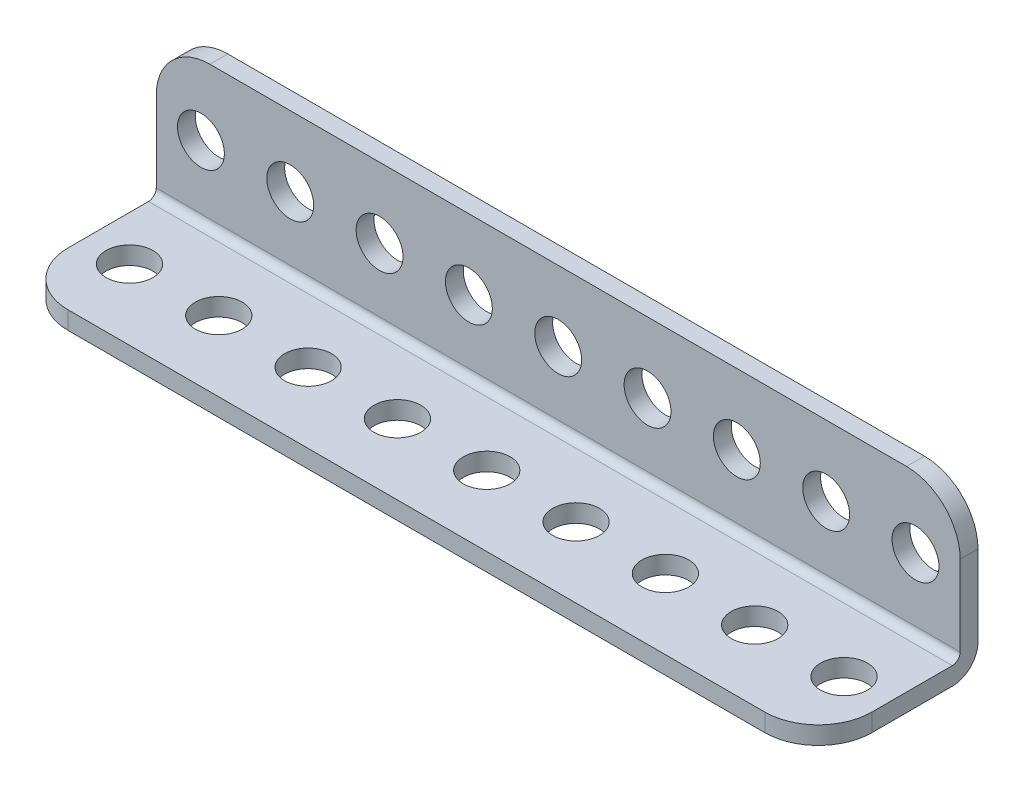
ISO-10303-21;
HEADER;
FILE_DESCRIPTION(('STEP AP214'),'2;1');
FILE_NAME('part.step','',(''),(''),'','','');
FILE_SCHEMA(('AUTOMOTIVE_DESIGN { 1 0 10303 214 1 1 1 1 }'));
ENDSEC;
DATA;
#1=APPLICATION_CONTEXT('core data for automotive mechanical design processes');
#2=APPLICATION_PROTOCOL_DEFINITION('international standard','automotive_design',2000,#1);
#3=PRODUCT_CONTEXT('',#1,'mechanical');
#4=PRODUCT('Part','Part','',(#3));
#5=PRODUCT_RELATED_PRODUCT_CATEGORY('part','',(#4));
#6=PRODUCT_DEFINITION_FORMATION('','',#4);
#7=PRODUCT_DEFINITION_CONTEXT('part definition',#1,'design');
#8=PRODUCT_DEFINITION('design','',#6,#7);
#9=PRODUCT_DEFINITION_SHAPE('','',#8);
#10=(LENGTH_UNIT() NAMED_UNIT(*) SI_UNIT(.MILLI.,.METRE.));
#11=(NAMED_UNIT(*) PLANE_ANGLE_UNIT() SI_UNIT($,.RADIAN.));
#12=(NAMED_UNIT(*) SI_UNIT($,.STERADIAN.) SOLID_ANGLE_UNIT());
#13=UNCERTAINTY_MEASURE_WITH_UNIT(LENGTH_MEASURE(1.E-05),#10,'distance_accuracy_value','');
#14=(GEOMETRIC_REPRESENTATION_CONTEXT(3) GLOBAL_UNCERTAINTY_ASSIGNED_CONTEXT((#13)) GLOBAL_UNIT_ASSIGNED_CONTEXT((#10,
#11,#12)) REPRESENTATION_CONTEXT('',''));
#15=CARTESIAN_POINT('',(0.,0.,0.));
#16=DIRECTION('',(0.,0.,1.));
#17=DIRECTION('',(1.,0.,0.));
#18=AXIS2_PLACEMENT_3D('',#15,#16,#17);
#19=CARTESIAN_POINT('',(67.2,7.9,-14.3));
#20=DIRECTION('',(0.,0.,1.));
#21=DIRECTION('',(0.,-1.,0.));
#22=AXIS2_PLACEMENT_3D('',#19,#20,#21);
#23=CYLINDRICAL_SURFACE('',#22,4.8);
#24=CARTESIAN_POINT('',(67.2,7.9,-14.3));
#25=DIRECTION('',(0.,0.,1.));
#26=DIRECTION('',(0.,-1.,0.));
#27=AXIS2_PLACEMENT_3D('',#24,#25,#26);
#28=CIRCLE('',#27,4.8);
#29=CARTESIAN_POINT('',(72.,7.9,-14.3));
#30=VERTEX_POINT('',#29);
#31=CARTESIAN_POINT('',(67.2,12.7,-14.3));
#32=VERTEX_POINT('',#31);
#33=EDGE_CURVE('E164',#30,#32,#28,.T.);
#34=ORIENTED_EDGE('',*,*,#33,.T.);
#35=DIRECTION('',(0.,0.,-1.));
#36=VECTOR('',#35,1.);
#37=CARTESIAN_POINT('',(67.2,12.7,-14.3));
#38=LINE('',#37,#36);
#39=CARTESIAN_POINT('',(67.2,12.7,-12.7));
#40=VERTEX_POINT('',#39);
#41=EDGE_CURVE('E175',#32,#40,#38,.F.);
#42=ORIENTED_EDGE('',*,*,#41,.T.);
#43=CARTESIAN_POINT('',(67.2,7.90000000000001,-12.7));
#44=DIRECTION('',(0.,0.,1.));
#45=DIRECTION('',(0.,-1.,0.));
#46=AXIS2_PLACEMENT_3D('',#43,#44,#45);
#47=CIRCLE('',#46,4.8);
#48=CARTESIAN_POINT('',(72.,7.90000000000001,-12.7));
#49=VERTEX_POINT('',#48);
#50=EDGE_CURVE('E166',#49,#40,#47,.T.);
#51=ORIENTED_EDGE('',*,*,#50,.F.);
#52=DIRECTION('',(0.,0.,1.));
#53=VECTOR('',#52,1.);
#54=CARTESIAN_POINT('',(72.,7.9,-14.3));
#55=LINE('',#54,#53);
#56=EDGE_CURVE('E178',#49,#30,#55,.F.);
#57=ORIENTED_EDGE('',*,*,#56,.T.);
#58=EDGE_LOOP('',(#34,#42,#51,#57));
#59=FACE_BOUND('',#58,.T.);
#60=ADVANCED_FACE('F16',(#59),#23,.T.);
#61=CARTESIAN_POINT('',(72.,12.7,-14.3));
#62=DIRECTION('',(0.,-1.,0.));
#63=DIRECTION('',(0.,0.,-1.));
#64=AXIS2_PLACEMENT_3D('',#61,#62,#63);
#65=PLANE('',#64);
#66=DIRECTION('',(1.,0.,0.));
#67=VECTOR('',#66,1.);
#68=CARTESIAN_POINT('',(0.,12.7,-12.7));
#69=LINE('',#68,#67);
#70=CARTESIAN_POINT('',(4.8,12.7,-12.7));
#71=VERTEX_POINT('',#70);
#72=EDGE_CURVE('E165',#40,#71,#69,.F.);
#73=ORIENTED_EDGE('',*,*,#72,.F.);
#74=ORIENTED_EDGE('',*,*,#41,.F.);
#75=DIRECTION('',(1.,0.,0.));
#76=VECTOR('',#75,1.);
#77=CARTESIAN_POINT('',(0.,12.7,-14.3));
#78=LINE('',#77,#76);
#79=CARTESIAN_POINT('',(4.8,12.7,-14.3));
#80=VERTEX_POINT('',#79);
#81=EDGE_CURVE('E161',#32,#80,#78,.F.);
#82=ORIENTED_EDGE('',*,*,#81,.T.);
#83=DIRECTION('',(0.,0.,1.));
#84=VECTOR('',#83,1.);
#85=CARTESIAN_POINT('',(4.8,12.7,-14.3));
#86=LINE('',#85,#84);
#87=EDGE_CURVE('E172',#71,#80,#86,.F.);
#88=ORIENTED_EDGE('',*,*,#87,.F.);
#89=EDGE_LOOP('',(#73,#74,#82,#88));
#90=FACE_BOUND('',#89,.T.);
#91=ADVANCED_FACE('F340',(#90),#65,.F.);
#92=CARTESIAN_POINT('',(4.8,7.9,-14.3));
#93=DIRECTION('',(0.,0.,1.));
#94=DIRECTION('',(0.,-1.,0.));
#95=AXIS2_PLACEMENT_3D('',#92,#93,#94);
#96=CYLINDRICAL_SURFACE('',#95,4.8);
#97=CARTESIAN_POINT('',(4.8,7.9,-14.3));
#98=DIRECTION('',(0.,0.,1.));
#99=DIRECTION('',(0.,-1.,0.));
#100=AXIS2_PLACEMENT_3D('',#97,#98,#99);
#101=CIRCLE('',#100,4.8);
#102=CARTESIAN_POINT('',(0.,7.9,-14.3));
#103=VERTEX_POINT('',#102);
#104=EDGE_CURVE('E163',#80,#103,#101,.T.);
#105=ORIENTED_EDGE('',*,*,#104,.T.);
#106=DIRECTION('',(0.,0.,1.));
#107=VECTOR('',#106,1.);
#108=CARTESIAN_POINT('',(0.,7.9,-14.3));
#109=LINE('',#108,#107);
#110=CARTESIAN_POINT('',(0.,7.90000000000001,-12.7));
#111=VERTEX_POINT('',#110);
#112=EDGE_CURVE('E109',#103,#111,#109,.T.);
#113=ORIENTED_EDGE('',*,*,#112,.T.);
#114=CARTESIAN_POINT('',(4.8,7.90000000000001,-12.7));
#115=DIRECTION('',(0.,0.,1.));
#116=DIRECTION('',(0.,-1.,0.));
#117=AXIS2_PLACEMENT_3D('',#114,#115,#116);
#118=CIRCLE('',#117,4.8);
#119=EDGE_CURVE('E117',#71,#111,#118,.T.);
#120=ORIENTED_EDGE('',*,*,#119,.F.);
#121=ORIENTED_EDGE('',*,*,#87,.T.);
#122=EDGE_LOOP('',(#105,#113,#120,#121));
#123=FACE_BOUND('',#122,.T.);
#124=ADVANCED_FACE('F342',(#123),#96,.T.);
#125=CARTESIAN_POINT('',(4.,6.4,-22.7));
#126=DIRECTION('',(0.,0.,1.));
#127=DIRECTION('',(1.,0.,0.));
#128=AXIS2_PLACEMENT_3D('',#125,#126,#127);
#129=CYLINDRICAL_SURFACE('',#128,2.1);
#130=CARTESIAN_POINT('',(4.,6.4,-12.7));
#131=DIRECTION('',(0.,0.,1.));
#132=DIRECTION('',(1.,0.,0.));
#133=AXIS2_PLACEMENT_3D('',#130,#131,#132);
#134=CIRCLE('',#133,2.1);
#135=CARTESIAN_POINT('',(6.1,6.4,-12.7));
#136=VERTEX_POINT('',#135);
#137=EDGE_CURVE('E116',#136,#136,#134,.F.);
#138=ORIENTED_EDGE('',*,*,#137,.F.);
#139=EDGE_LOOP('',(#138));
#140=FACE_BOUND('',#139,.T.);
#141=CARTESIAN_POINT('',(4.,6.4,-14.3));
#142=DIRECTION('',(0.,0.,1.));
#143=DIRECTION('',(1.,0.,0.));
#144=AXIS2_PLACEMENT_3D('',#141,#142,#143);
#145=CIRCLE('',#144,2.1);
#146=CARTESIAN_POINT('',(6.1,6.4,-14.3));
#147=VERTEX_POINT('',#146);
#148=EDGE_CURVE('E266',#147,#147,#145,.F.);
#149=ORIENTED_EDGE('',*,*,#148,.T.);
#150=EDGE_LOOP('',(#149));
#151=FACE_BOUND('',#150,.T.);
#152=ADVANCED_FACE('F344',(#140,#151),#129,.F.);
#153=CARTESIAN_POINT('',(12.,6.4,-22.7));
#154=DIRECTION('',(0.,0.,1.));
#155=DIRECTION('',(1.,0.,0.));
#156=AXIS2_PLACEMENT_3D('',#153,#154,#155);
#157=CYLINDRICAL_SURFACE('',#156,2.1);
#158=CARTESIAN_POINT('',(12.,6.4,-12.7));
#159=DIRECTION('',(0.,0.,1.));
#160=DIRECTION('',(1.,0.,0.));
#161=AXIS2_PLACEMENT_3D('',#158,#159,#160);
#162=CIRCLE('',#161,2.1);
#163=CARTESIAN_POINT('',(14.1,6.4,-12.7));
#164=VERTEX_POINT('',#163);
#165=EDGE_CURVE('E293',#164,#164,#162,.F.);
#166=ORIENTED_EDGE('',*,*,#165,.F.);
#167=EDGE_LOOP('',(#166));
#168=FACE_BOUND('',#167,.T.);
#169=CARTESIAN_POINT('',(12.,6.4,-14.3));
#170=DIRECTION('',(0.,0.,1.));
#171=DIRECTION('',(1.,0.,0.));
#172=AXIS2_PLACEMENT_3D('',#169,#170,#171);
#173=CIRCLE('',#172,2.1);
#174=CARTESIAN_POINT('',(14.1,6.4,-14.3));
#175=VERTEX_POINT('',#174);
#176=EDGE_CURVE('E263',#175,#175,#173,.F.);
#177=ORIENTED_EDGE('',*,*,#176,.T.);
#178=EDGE_LOOP('',(#177));
#179=FACE_BOUND('',#178,.T.);
#180=ADVANCED_FACE('F351',(#168,#179),#157,.F.);
#181=CARTESIAN_POINT('',(68.,6.4,-22.7));
#182=DIRECTION('',(0.,0.,1.));
#183=DIRECTION('',(1.,0.,0.));
#184=AXIS2_PLACEMENT_3D('',#181,#182,#183);
#185=CYLINDRICAL_SURFACE('',#184,2.1);
#186=CARTESIAN_POINT('',(68.,6.4,-12.7));
#187=DIRECTION('',(0.,0.,1.));
#188=DIRECTION('',(1.,0.,0.));
#189=AXIS2_PLACEMENT_3D('',#186,#187,#188);
#190=CIRCLE('',#189,2.1);
#191=CARTESIAN_POINT('',(70.1,6.4,-12.7));
#192=VERTEX_POINT('',#191);
#193=EDGE_CURVE('E290',#192,#192,#190,.F.);
#194=ORIENTED_EDGE('',*,*,#193,.F.);
#195=EDGE_LOOP('',(#194));
#196=FACE_BOUND('',#195,.T.);
#197=CARTESIAN_POINT('',(68.,6.4,-14.3));
#198=DIRECTION('',(0.,0.,1.));
#199=DIRECTION('',(1.,0.,0.));
#200=AXIS2_PLACEMENT_3D('',#197,#198,#199);
#201=CIRCLE('',#200,2.1);
#202=CARTESIAN_POINT('',(70.1,6.4,-14.3));
#203=VERTEX_POINT('',#202);
#204=EDGE_CURVE('E260',#203,#203,#201,.F.);
#205=ORIENTED_EDGE('',*,*,#204,.T.);
#206=EDGE_LOOP('',(#205));
#207=FACE_BOUND('',#206,.T.);
#208=ADVANCED_FACE('F443',(#196,#207),#185,.F.);
#209=CARTESIAN_POINT('',(60.,6.4,-22.7));
#210=DIRECTION('',(0.,0.,1.));
#211=DIRECTION('',(1.,0.,0.));
#212=AXIS2_PLACEMENT_3D('',#209,#210,#211);
#213=CYLINDRICAL_SURFACE('',#212,2.1);
#214=CARTESIAN_POINT('',(60.,6.4,-12.7));
#215=DIRECTION('',(0.,0.,1.));
#216=DIRECTION('',(1.,0.,0.));
#217=AXIS2_PLACEMENT_3D('',#214,#215,#216);
#218=CIRCLE('',#217,2.1);
#219=CARTESIAN_POINT('',(62.1,6.4,-12.7));
#220=VERTEX_POINT('',#219);
#221=EDGE_CURVE('E287',#220,#220,#218,.F.);
#222=ORIENTED_EDGE('',*,*,#221,.F.);
#223=EDGE_LOOP('',(#222));
#224=FACE_BOUND('',#223,.T.);
#225=CARTESIAN_POINT('',(60.,6.4,-14.3));
#226=DIRECTION('',(0.,0.,1.));
#227=DIRECTION('',(1.,0.,0.));
#228=AXIS2_PLACEMENT_3D('',#225,#226,#227);
#229=CIRCLE('',#228,2.1);
#230=CARTESIAN_POINT('',(62.1,6.4,-14.3));
#231=VERTEX_POINT('',#230);
#232=EDGE_CURVE('E257',#231,#231,#229,.F.);
#233=ORIENTED_EDGE('',*,*,#232,.T.);
#234=EDGE_LOOP('',(#233));
#235=FACE_BOUND('',#234,.T.);
#236=ADVANCED_FACE('F439',(#224,#235),#213,.F.);
#237=CARTESIAN_POINT('',(52.,6.4,-22.7));
#238=DIRECTION('',(0.,0.,1.));
#239=DIRECTION('',(1.,0.,0.));
#240=AXIS2_PLACEMENT_3D('',#237,#238,#239);
#241=CYLINDRICAL_SURFACE('',#240,2.1);
#242=CARTESIAN_POINT('',(52.,6.4,-12.7));
#243=DIRECTION('',(0.,0.,1.));
#244=DIRECTION('',(1.,0.,0.));
#245=AXIS2_PLACEMENT_3D('',#242,#243,#244);
#246=CIRCLE('',#245,2.1);
#247=CARTESIAN_POINT('',(54.1,6.4,-12.7));
#248=VERTEX_POINT('',#247);
#249=EDGE_CURVE('E284',#248,#248,#246,.F.);
#250=ORIENTED_EDGE('',*,*,#249,.F.);
#251=EDGE_LOOP('',(#250));
#252=FACE_BOUND('',#251,.T.);
#253=CARTESIAN_POINT('',(52.,6.4,-14.3));
#254=DIRECTION('',(0.,0.,1.));
#255=DIRECTION('',(1.,0.,0.));
#256=AXIS2_PLACEMENT_3D('',#253,#254,#255);
#257=CIRCLE('',#256,2.1);
#258=CARTESIAN_POINT('',(54.1,6.4,-14.3));
#259=VERTEX_POINT('',#258);
#260=EDGE_CURVE('E254',#259,#259,#257,.F.);
#261=ORIENTED_EDGE('',*,*,#260,.T.);
#262=EDGE_LOOP('',(#261));
#263=FACE_BOUND('',#262,.T.);
#264=ADVANCED_FACE('F435',(#252,#263),#241,.F.);
#265=CARTESIAN_POINT('',(44.,6.4,-22.7));
#266=DIRECTION('',(0.,0.,1.));
#267=DIRECTION('',(1.,0.,0.));
#268=AXIS2_PLACEMENT_3D('',#265,#266,#267);
#269=CYLINDRICAL_SURFACE('',#268,2.1);
#270=CARTESIAN_POINT('',(44.,6.4,-12.7));
#271=DIRECTION('',(0.,0.,1.));
#272=DIRECTION('',(1.,0.,0.));
#273=AXIS2_PLACEMENT_3D('',#270,#271,#272);
#274=CIRCLE('',#273,2.1);
#275=CARTESIAN_POINT('',(46.1,6.4,-12.7));
#276=VERTEX_POINT('',#275);
#277=EDGE_CURVE('E281',#276,#276,#274,.F.);
#278=ORIENTED_EDGE('',*,*,#277,.F.);
#279=EDGE_LOOP('',(#278));
#280=FACE_BOUND('',#279,.T.);
#281=CARTESIAN_POINT('',(44.,6.4,-14.3));
#282=DIRECTION('',(0.,0.,1.));
#283=DIRECTION('',(1.,0.,0.));
#284=AXIS2_PLACEMENT_3D('',#281,#282,#283);
#285=CIRCLE('',#284,2.1);
#286=CARTESIAN_POINT('',(46.1,6.4,-14.3));
#287=VERTEX_POINT('',#286);
#288=EDGE_CURVE('E251',#287,#287,#285,.F.);
#289=ORIENTED_EDGE('',*,*,#288,.T.);
#290=EDGE_LOOP('',(#289));
#291=FACE_BOUND('',#290,.T.);
#292=ADVANCED_FACE('F431',(#280,#291),#269,.F.);
#293=CARTESIAN_POINT('',(36.,6.4,-22.7));
#294=DIRECTION('',(0.,0.,1.));
#295=DIRECTION('',(1.,0.,0.));
#296=AXIS2_PLACEMENT_3D('',#293,#294,#295);
#297=CYLINDRICAL_SURFACE('',#296,2.1);
#298=CARTESIAN_POINT('',(36.,6.4,-12.7));
#299=DIRECTION('',(0.,0.,1.));
#300=DIRECTION('',(1.,0.,0.));
#301=AXIS2_PLACEMENT_3D('',#298,#299,#300);
#302=CIRCLE('',#301,2.1);
#303=CARTESIAN_POINT('',(38.1,6.4,-12.7));
#304=VERTEX_POINT('',#303);
#305=EDGE_CURVE('E278',#304,#304,#302,.F.);
#306=ORIENTED_EDGE('',*,*,#305,.F.);
#307=EDGE_LOOP('',(#306));
#308=FACE_BOUND('',#307,.T.);
#309=CARTESIAN_POINT('',(36.,6.4,-14.3));
#310=DIRECTION('',(0.,0.,1.));
#311=DIRECTION('',(1.,0.,0.));
#312=AXIS2_PLACEMENT_3D('',#309,#310,#311);
#313=CIRCLE('',#312,2.1);
#314=CARTESIAN_POINT('',(38.1,6.4,-14.3));
#315=VERTEX_POINT('',#314);
#316=EDGE_CURVE('E248',#315,#315,#313,.F.);
#317=ORIENTED_EDGE('',*,*,#316,.T.);
#318=EDGE_LOOP('',(#317));
#319=FACE_BOUND('',#318,.T.);
#320=ADVANCED_FACE('F427',(#308,#319),#297,.F.);
#321=CARTESIAN_POINT('',(28.,6.4,-22.7));
#322=DIRECTION('',(0.,0.,1.));
#323=DIRECTION('',(1.,0.,0.));
#324=AXIS2_PLACEMENT_3D('',#321,#322,#323);
#325=CYLINDRICAL_SURFACE('',#324,2.1);
#326=CARTESIAN_POINT('',(28.,6.4,-12.7));
#327=DIRECTION('',(0.,0.,1.));
#328=DIRECTION('',(1.,0.,0.));
#329=AXIS2_PLACEMENT_3D('',#326,#327,#328);
#330=CIRCLE('',#329,2.1);
#331=CARTESIAN_POINT('',(30.1,6.4,-12.7));
#332=VERTEX_POINT('',#331);
#333=EDGE_CURVE('E275',#332,#332,#330,.F.);
#334=ORIENTED_EDGE('',*,*,#333,.F.);
#335=EDGE_LOOP('',(#334));
#336=FACE_BOUND('',#335,.T.);
#337=CARTESIAN_POINT('',(28.,6.4,-14.3));
#338=DIRECTION('',(0.,0.,1.));
#339=DIRECTION('',(1.,0.,0.));
#340=AXIS2_PLACEMENT_3D('',#337,#338,#339);
#341=CIRCLE('',#340,2.1);
#342=CARTESIAN_POINT('',(30.1,6.4,-14.3));
#343=VERTEX_POINT('',#342);
#344=EDGE_CURVE('E245',#343,#343,#341,.F.);
#345=ORIENTED_EDGE('',*,*,#344,.T.);
#346=EDGE_LOOP('',(#345));
#347=FACE_BOUND('',#346,.T.);
#348=ADVANCED_FACE('F423',(#336,#347),#325,.F.);
#349=CARTESIAN_POINT('',(20.,6.4,-22.7));
#350=DIRECTION('',(0.,0.,1.));
#351=DIRECTION('',(1.,0.,0.));
#352=AXIS2_PLACEMENT_3D('',#349,#350,#351);
#353=CYLINDRICAL_SURFACE('',#352,2.1);
#354=CARTESIAN_POINT('',(20.,6.4,-12.7));
#355=DIRECTION('',(0.,0.,1.));
#356=DIRECTION('',(1.,0.,0.));
#357=AXIS2_PLACEMENT_3D('',#354,#355,#356);
#358=CIRCLE('',#357,2.1);
#359=CARTESIAN_POINT('',(22.1,6.4,-12.7));
#360=VERTEX_POINT('',#359);
#361=EDGE_CURVE('E272',#360,#360,#358,.F.);
#362=ORIENTED_EDGE('',*,*,#361,.F.);
#363=EDGE_LOOP('',(#362));
#364=FACE_BOUND('',#363,.T.);
#365=CARTESIAN_POINT('',(20.,6.4,-14.3));
#366=DIRECTION('',(0.,0.,1.));
#367=DIRECTION('',(1.,0.,0.));
#368=AXIS2_PLACEMENT_3D('',#365,#366,#367);
#369=CIRCLE('',#368,2.1);
#370=CARTESIAN_POINT('',(22.1,6.4,-14.3));
#371=VERTEX_POINT('',#370);
#372=EDGE_CURVE('E169',#371,#371,#369,.F.);
#373=ORIENTED_EDGE('',*,*,#372,.T.);
#374=EDGE_LOOP('',(#373));
#375=FACE_BOUND('',#374,.T.);
#376=ADVANCED_FACE('F420',(#364,#375),#353,.F.);
#377=CARTESIAN_POINT('',(0.,0.699999999999998,-12.));
#378=DIRECTION('',(-1.,0.,0.));
#379=DIRECTION('',(0.,-1.,0.));
#380=AXIS2_PLACEMENT_3D('',#377,#378,#379);
#381=CYLINDRICAL_SURFACE('',#380,0.700000000000001);
#382=DIRECTION('',(1.,0.,0.));
#383=VECTOR('',#382,1.);
#384=CARTESIAN_POINT('',(0.,0.700000000000005,-12.7));
#385=LINE('',#384,#383);
#386=CARTESIAN_POINT('',(0.,0.700000000000001,-12.7));
#387=VERTEX_POINT('',#386);
#388=CARTESIAN_POINT('',(72.,0.699999999999999,-12.7));
#389=VERTEX_POINT('',#388);
#390=EDGE_CURVE('E111',#387,#389,#385,.T.);
#391=ORIENTED_EDGE('',*,*,#390,.F.);
#392=CARTESIAN_POINT('',(0.,0.699999999999998,-12.));
#393=DIRECTION('',(-1.,0.,0.));
#394=DIRECTION('',(0.,-1.,0.));
#395=AXIS2_PLACEMENT_3D('',#392,#393,#394);
#396=CIRCLE('',#395,0.700000000000001);
#397=CARTESIAN_POINT('',(0.,0.,-12.));
#398=VERTEX_POINT('',#397);
#399=EDGE_CURVE('E19',#398,#387,#396,.F.);
#400=ORIENTED_EDGE('',*,*,#399,.F.);
#401=DIRECTION('',(1.,0.,0.));
#402=VECTOR('',#401,1.);
#403=CARTESIAN_POINT('',(0.,0.,-12.));
#404=LINE('',#403,#402);
#405=CARTESIAN_POINT('',(72.,0.,-12.));
#406=VERTEX_POINT('',#405);
#407=EDGE_CURVE('E157',#398,#406,#404,.T.);
#408=ORIENTED_EDGE('',*,*,#407,.T.);
#409=CARTESIAN_POINT('',(72.,0.699999999999992,-12.));
#410=DIRECTION('',(-1.,0.,0.));
#411=DIRECTION('',(0.,-1.,0.));
#412=AXIS2_PLACEMENT_3D('',#409,#410,#411);
#413=CIRCLE('',#412,0.700000000000001);
#414=EDGE_CURVE('E108',#389,#406,#413,.T.);
#415=ORIENTED_EDGE('',*,*,#414,.F.);
#416=EDGE_LOOP('',(#391,#400,#408,#415));
#417=FACE_BOUND('',#416,.T.);
#418=ADVANCED_FACE('F112',(#417),#381,.F.);
#419=CARTESIAN_POINT('',(0.,0.,-12.7));
#420=DIRECTION('',(0.,0.,1.));
#421=DIRECTION('',(0.,-1.,0.));
#422=AXIS2_PLACEMENT_3D('',#419,#420,#421);
#423=PLANE('',#422);
#424=ORIENTED_EDGE('',*,*,#361,.T.);
#425=EDGE_LOOP('',(#424));
#426=FACE_BOUND('',#425,.T.);
#427=ORIENTED_EDGE('',*,*,#333,.T.);
#428=EDGE_LOOP('',(#427));
#429=FACE_BOUND('',#428,.T.);
#430=ORIENTED_EDGE('',*,*,#305,.T.);
#431=EDGE_LOOP('',(#430));
#432=FACE_BOUND('',#431,.T.);
#433=ORIENTED_EDGE('',*,*,#277,.T.);
#434=EDGE_LOOP('',(#433));
#435=FACE_BOUND('',#434,.T.);
#436=ORIENTED_EDGE('',*,*,#249,.T.);
#437=EDGE_LOOP('',(#436));
#438=FACE_BOUND('',#437,.T.);
#439=ORIENTED_EDGE('',*,*,#221,.T.);
#440=EDGE_LOOP('',(#439));
#441=FACE_BOUND('',#440,.T.);
#442=ORIENTED_EDGE('',*,*,#193,.T.);
#443=EDGE_LOOP('',(#442));
#444=FACE_BOUND('',#443,.T.);
#445=ORIENTED_EDGE('',*,*,#165,.T.);
#446=EDGE_LOOP('',(#445));
#447=FACE_BOUND('',#446,.T.);
#448=ORIENTED_EDGE('',*,*,#137,.T.);
#449=EDGE_LOOP('',(#448));
#450=FACE_BOUND('',#449,.T.);
#451=DIRECTION('',(0.,1.,0.));
#452=VECTOR('',#451,1.);
#453=CARTESIAN_POINT('',(0.,-1.6,-12.7));
#454=LINE('',#453,#452);
#455=EDGE_CURVE('E105',#387,#111,#454,.T.);
#456=ORIENTED_EDGE('',*,*,#455,.F.);
#457=ORIENTED_EDGE('',*,*,#390,.T.);
#458=DIRECTION('',(0.,1.,0.));
#459=VECTOR('',#458,1.);
#460=CARTESIAN_POINT('',(72.,-1.6,-12.7));
#461=LINE('',#460,#459);
#462=EDGE_CURVE('E152',#49,#389,#461,.F.);
#463=ORIENTED_EDGE('',*,*,#462,.F.);
#464=ORIENTED_EDGE('',*,*,#50,.T.);
#465=ORIENTED_EDGE('',*,*,#72,.T.);
#466=ORIENTED_EDGE('',*,*,#119,.T.);
#467=EDGE_LOOP('',(#456,#457,#463,#464,#465,#466));
#468=FACE_BOUND('',#467,.T.);
#469=ADVANCED_FACE('F120',(#426,#429,#432,#435,#438,#441,#444,#447,#450,#468),#423,.T.);
#470=CARTESIAN_POINT('',(0.,0.,-14.3));
#471=DIRECTION('',(0.,0.,1.));
#472=DIRECTION('',(0.,-1.,0.));
#473=AXIS2_PLACEMENT_3D('',#470,#471,#472);
#474=PLANE('',#473);
#475=ORIENTED_EDGE('',*,*,#372,.F.);
#476=EDGE_LOOP('',(#475));
#477=FACE_BOUND('',#476,.T.);
#478=ORIENTED_EDGE('',*,*,#344,.F.);
#479=EDGE_LOOP('',(#478));
#480=FACE_BOUND('',#479,.T.);
#481=ORIENTED_EDGE('',*,*,#316,.F.);
#482=EDGE_LOOP('',(#481));
#483=FACE_BOUND('',#482,.T.);
#484=ORIENTED_EDGE('',*,*,#288,.F.);
#485=EDGE_LOOP('',(#484));
#486=FACE_BOUND('',#485,.T.);
#487=ORIENTED_EDGE('',*,*,#260,.F.);
#488=EDGE_LOOP('',(#487));
#489=FACE_BOUND('',#488,.T.);
#490=ORIENTED_EDGE('',*,*,#232,.F.);
#491=EDGE_LOOP('',(#490));
#492=FACE_BOUND('',#491,.T.);
#493=ORIENTED_EDGE('',*,*,#204,.F.);
#494=EDGE_LOOP('',(#493));
#495=FACE_BOUND('',#494,.T.);
#496=ORIENTED_EDGE('',*,*,#176,.F.);
#497=EDGE_LOOP('',(#496));
#498=FACE_BOUND('',#497,.T.);
#499=ORIENTED_EDGE('',*,*,#148,.F.);
#500=EDGE_LOOP('',(#499));
#501=FACE_BOUND('',#500,.T.);
#502=ORIENTED_EDGE('',*,*,#81,.F.);
#503=ORIENTED_EDGE('',*,*,#33,.F.);
#504=DIRECTION('',(0.,1.,0.));
#505=VECTOR('',#504,1.);
#506=CARTESIAN_POINT('',(72.,-1.6,-14.3));
#507=LINE('',#506,#505);
#508=CARTESIAN_POINT('',(72.,0.699999999999995,-14.3));
#509=VERTEX_POINT('',#508);
#510=EDGE_CURVE('E154',#509,#30,#507,.T.);
#511=ORIENTED_EDGE('',*,*,#510,.F.);
#512=DIRECTION('',(-1.,0.,0.));
#513=VECTOR('',#512,1.);
#514=CARTESIAN_POINT('',(0.,0.700000000000003,-14.3));
#515=LINE('',#514,#513);
#516=CARTESIAN_POINT('',(0.,0.7,-14.3));
#517=VERTEX_POINT('',#516);
#518=EDGE_CURVE('E132',#517,#509,#515,.F.);
#519=ORIENTED_EDGE('',*,*,#518,.F.);
#520=DIRECTION('',(0.,1.,0.));
#521=VECTOR('',#520,1.);
#522=CARTESIAN_POINT('',(0.,-1.6,-14.3));
#523=LINE('',#522,#521);
#524=EDGE_CURVE('E123',#103,#517,#523,.F.);
#525=ORIENTED_EDGE('',*,*,#524,.F.);
#526=ORIENTED_EDGE('',*,*,#104,.F.);
#527=EDGE_LOOP('',(#502,#503,#511,#519,#525,#526));
#528=FACE_BOUND('',#527,.T.);
#529=ADVANCED_FACE('F333',(#477,#480,#483,#486,#489,#492,#495,#498,#501,#528),#474,.F.);
#530=CARTESIAN_POINT('',(0.,0.,0.));
#531=DIRECTION('',(0.,-1.,0.));
#532=DIRECTION('',(0.,0.,-1.));
#533=AXIS2_PLACEMENT_3D('',#530,#531,#532);
#534=PLANE('',#533);
#535=CARTESIAN_POINT('',(20.,0.,-6.30000000000005));
#536=DIRECTION('',(0.,1.,0.));
#537=DIRECTION('',(0.,0.,1.));
#538=AXIS2_PLACEMENT_3D('',#535,#536,#537);
#539=CIRCLE('',#538,2.1);
#540=CARTESIAN_POINT('',(20.,0.,-4.20000000000005));
#541=VERTEX_POINT('',#540);
#542=EDGE_CURVE('E210',#541,#541,#539,.F.);
#543=ORIENTED_EDGE('',*,*,#542,.T.);
#544=EDGE_LOOP('',(#543));
#545=FACE_BOUND('',#544,.T.);
#546=CARTESIAN_POINT('',(28.,0.,-6.30000000000005));
#547=DIRECTION('',(0.,1.,0.));
#548=DIRECTION('',(0.,0.,1.));
#549=AXIS2_PLACEMENT_3D('',#546,#547,#548);
#550=CIRCLE('',#549,2.1);
#551=CARTESIAN_POINT('',(28.,0.,-4.20000000000005));
#552=VERTEX_POINT('',#551);
#553=EDGE_CURVE('E213',#552,#552,#550,.F.);
#554=ORIENTED_EDGE('',*,*,#553,.T.);
#555=EDGE_LOOP('',(#554));
#556=FACE_BOUND('',#555,.T.);
#557=CARTESIAN_POINT('',(36.,0.,-6.30000000000005));
#558=DIRECTION('',(0.,1.,0.));
#559=DIRECTION('',(0.,0.,1.));
#560=AXIS2_PLACEMENT_3D('',#557,#558,#559);
#561=CIRCLE('',#560,2.1);
#562=CARTESIAN_POINT('',(36.,0.,-4.20000000000005));
#563=VERTEX_POINT('',#562);
#564=EDGE_CURVE('E216',#563,#563,#561,.F.);
#565=ORIENTED_EDGE('',*,*,#564,.T.);
#566=EDGE_LOOP('',(#565));
#567=FACE_BOUND('',#566,.T.);
#568=CARTESIAN_POINT('',(44.,0.,-6.30000000000005));
#569=DIRECTION('',(0.,1.,0.));
#570=DIRECTION('',(0.,0.,1.));
#571=AXIS2_PLACEMENT_3D('',#568,#569,#570);
#572=CIRCLE('',#571,2.1);
#573=CARTESIAN_POINT('',(44.,0.,-4.20000000000005));
#574=VERTEX_POINT('',#573);
#575=EDGE_CURVE('E219',#574,#574,#572,.F.);
#576=ORIENTED_EDGE('',*,*,#575,.T.);
#577=EDGE_LOOP('',(#576));
#578=FACE_BOUND('',#577,.T.);
#579=CARTESIAN_POINT('',(52.,0.,-6.30000000000005));
#580=DIRECTION('',(0.,1.,0.));
#581=DIRECTION('',(0.,0.,1.));
#582=AXIS2_PLACEMENT_3D('',#579,#580,#581);
#583=CIRCLE('',#582,2.1);
#584=CARTESIAN_POINT('',(52.,0.,-4.20000000000005));
#585=VERTEX_POINT('',#584);
#586=EDGE_CURVE('E222',#585,#585,#583,.F.);
#587=ORIENTED_EDGE('',*,*,#586,.T.);
#588=EDGE_LOOP('',(#587));
#589=FACE_BOUND('',#588,.T.);
#590=CARTESIAN_POINT('',(60.,0.,-6.30000000000005));
#591=DIRECTION('',(0.,1.,0.));
#592=DIRECTION('',(0.,0.,1.));
#593=AXIS2_PLACEMENT_3D('',#590,#591,#592);
#594=CIRCLE('',#593,2.1);
#595=CARTESIAN_POINT('',(60.,0.,-4.20000000000005));
#596=VERTEX_POINT('',#595);
#597=EDGE_CURVE('E225',#596,#596,#594,.F.);
#598=ORIENTED_EDGE('',*,*,#597,.T.);
#599=EDGE_LOOP('',(#598));
#600=FACE_BOUND('',#599,.T.);
#601=CARTESIAN_POINT('',(68.,0.,-6.30000000000005));
#602=DIRECTION('',(0.,1.,0.));
#603=DIRECTION('',(0.,0.,1.));
#604=AXIS2_PLACEMENT_3D('',#601,#602,#603);
#605=CIRCLE('',#604,2.1);
#606=CARTESIAN_POINT('',(68.,0.,-4.20000000000005));
#607=VERTEX_POINT('',#606);
#608=EDGE_CURVE('E228',#607,#607,#605,.F.);
#609=ORIENTED_EDGE('',*,*,#608,.T.);
#610=EDGE_LOOP('',(#609));
#611=FACE_BOUND('',#610,.T.);
#612=CARTESIAN_POINT('',(12.,0.,-6.30000000000005));
#613=DIRECTION('',(0.,1.,0.));
#614=DIRECTION('',(0.,0.,1.));
#615=AXIS2_PLACEMENT_3D('',#612,#613,#614);
#616=CIRCLE('',#615,2.1);
#617=CARTESIAN_POINT('',(12.,0.,-4.20000000000005));
#618=VERTEX_POINT('',#617);
#619=EDGE_CURVE('E231',#618,#618,#616,.F.);
#620=ORIENTED_EDGE('',*,*,#619,.T.);
#621=EDGE_LOOP('',(#620));
#622=FACE_BOUND('',#621,.T.);
#623=CARTESIAN_POINT('',(4.,0.,-6.30000000000005));
#624=DIRECTION('',(0.,1.,0.));
#625=DIRECTION('',(0.,0.,1.));
#626=AXIS2_PLACEMENT_3D('',#623,#624,#625);
#627=CIRCLE('',#626,2.1);
#628=CARTESIAN_POINT('',(4.,0.,-4.20000000000005));
#629=VERTEX_POINT('',#628);
#630=EDGE_CURVE('E234',#629,#629,#627,.F.);
#631=ORIENTED_EDGE('',*,*,#630,.T.);
#632=EDGE_LOOP('',(#631));
#633=FACE_BOUND('',#632,.T.);
#634=DIRECTION('',(1.,0.,0.));
#635=VECTOR('',#634,1.);
#636=CARTESIAN_POINT('',(0.,0.,0.));
#637=LINE('',#636,#635);
#638=CARTESIAN_POINT('',(67.2,0.,0.));
#639=VERTEX_POINT('',#638);
#640=CARTESIAN_POINT('',(4.8,0.,0.));
#641=VERTEX_POINT('',#640);
#642=EDGE_CURVE('E144',#639,#641,#637,.F.);
#643=ORIENTED_EDGE('',*,*,#642,.F.);
#644=CARTESIAN_POINT('',(67.2,0.,-4.8));
#645=DIRECTION('',(0.,1.,0.));
#646=DIRECTION('',(0.,0.,1.));
#647=AXIS2_PLACEMENT_3D('',#644,#645,#646);
#648=CIRCLE('',#647,4.8);
#649=CARTESIAN_POINT('',(72.,0.,-4.8));
#650=VERTEX_POINT('',#649);
#651=EDGE_CURVE('E148',#650,#639,#648,.F.);
#652=ORIENTED_EDGE('',*,*,#651,.F.);
#653=DIRECTION('',(0.,0.,-1.));
#654=VECTOR('',#653,1.);
#655=CARTESIAN_POINT('',(72.,0.,0.));
#656=LINE('',#655,#654);
#657=EDGE_CURVE('E149',#406,#650,#656,.F.);
#658=ORIENTED_EDGE('',*,*,#657,.F.);
#659=ORIENTED_EDGE('',*,*,#407,.F.);
#660=DIRECTION('',(0.,0.,1.));
#661=VECTOR('',#660,1.);
#662=CARTESIAN_POINT('',(0.,0.,0.));
#663=LINE('',#662,#661);
#664=CARTESIAN_POINT('',(0.,0.,-4.8));
#665=VERTEX_POINT('',#664);
#666=EDGE_CURVE('E107',#665,#398,#663,.F.);
#667=ORIENTED_EDGE('',*,*,#666,.F.);
#668=CARTESIAN_POINT('',(4.8,0.,-4.8));
#669=DIRECTION('',(0.,1.,0.));
#670=DIRECTION('',(0.,0.,1.));
#671=AXIS2_PLACEMENT_3D('',#668,#669,#670);
#672=CIRCLE('',#671,4.8);
#673=EDGE_CURVE('E140',#641,#665,#672,.F.);
#674=ORIENTED_EDGE('',*,*,#673,.F.);
#675=EDGE_LOOP('',(#643,#652,#658,#659,#667,#674));
#676=FACE_BOUND('',#675,.T.);
#677=ADVANCED_FACE('F306',(#545,#556,#567,#578,#589,#600,#611,#622,#633,#676),#534,.F.);
#678=CARTESIAN_POINT('',(72.,-1.6,0.));
#679=DIRECTION('',(1.,0.,0.));
#680=DIRECTION('',(0.,0.,-1.));
#681=AXIS2_PLACEMENT_3D('',#678,#679,#680);
#682=PLANE('',#681);
#683=ORIENTED_EDGE('',*,*,#657,.T.);
#684=DIRECTION('',(0.,1.,0.));
#685=VECTOR('',#684,1.);
#686=CARTESIAN_POINT('',(72.,-1.6,-4.8));
#687=LINE('',#686,#685);
#688=CARTESIAN_POINT('',(72.,-1.6,-4.8));
#689=VERTEX_POINT('',#688);
#690=EDGE_CURVE('E145',#689,#650,#687,.T.);
#691=ORIENTED_EDGE('',*,*,#690,.F.);
#692=DIRECTION('',(0.,0.,-1.));
#693=VECTOR('',#692,1.);
#694=CARTESIAN_POINT('',(72.,-1.6,0.));
#695=LINE('',#694,#693);
#696=CARTESIAN_POINT('',(72.,-1.6,-12.));
#697=VERTEX_POINT('',#696);
#698=EDGE_CURVE('E209',#697,#689,#695,.F.);
#699=ORIENTED_EDGE('',*,*,#698,.F.);
#700=CARTESIAN_POINT('',(72.,0.699999999999992,-12.));
#701=DIRECTION('',(-1.,0.,0.));
#702=DIRECTION('',(0.,-1.,0.));
#703=AXIS2_PLACEMENT_3D('',#700,#701,#702);
#704=CIRCLE('',#703,2.3);
#705=EDGE_CURVE('E160',#509,#697,#704,.T.);
#706=ORIENTED_EDGE('',*,*,#705,.F.);
#707=ORIENTED_EDGE('',*,*,#510,.T.);
#708=ORIENTED_EDGE('',*,*,#56,.F.);
#709=ORIENTED_EDGE('',*,*,#462,.T.);
#710=ORIENTED_EDGE('',*,*,#414,.T.);
#711=EDGE_LOOP('',(#683,#691,#699,#706,#707,#708,#709,#710));
#712=FACE_BOUND('',#711,.T.);
#713=ADVANCED_FACE('F301',(#712),#682,.T.);
#714=CARTESIAN_POINT('',(67.2,-1.6,-4.8));
#715=DIRECTION('',(0.,1.,0.));
#716=DIRECTION('',(0.,0.,1.));
#717=AXIS2_PLACEMENT_3D('',#714,#715,#716);
#718=CYLINDRICAL_SURFACE('',#717,4.8);
#719=CARTESIAN_POINT('',(67.2,-1.6,-4.8));
#720=DIRECTION('',(0.,1.,0.));
#721=DIRECTION('',(0.,0.,1.));
#722=AXIS2_PLACEMENT_3D('',#719,#720,#721);
#723=CIRCLE('',#722,4.8);
#724=CARTESIAN_POINT('',(67.2,-1.6,0.));
#725=VERTEX_POINT('',#724);
#726=EDGE_CURVE('E206',#689,#725,#723,.F.);
#727=ORIENTED_EDGE('',*,*,#726,.F.);
#728=ORIENTED_EDGE('',*,*,#690,.T.);
#729=ORIENTED_EDGE('',*,*,#651,.T.);
#730=DIRECTION('',(0.,1.,0.));
#731=VECTOR('',#730,1.);
#732=CARTESIAN_POINT('',(67.2,-1.6,0.));
#733=LINE('',#732,#731);
#734=EDGE_CURVE('E141',#725,#639,#733,.T.);
#735=ORIENTED_EDGE('',*,*,#734,.F.);
#736=EDGE_LOOP('',(#727,#728,#729,#735));
#737=FACE_BOUND('',#736,.T.);
#738=ADVANCED_FACE('F310',(#737),#718,.T.);
#739=CARTESIAN_POINT('',(0.,-1.6,0.));
#740=DIRECTION('',(0.,0.,1.));
#741=DIRECTION('',(1.,0.,0.));
#742=AXIS2_PLACEMENT_3D('',#739,#740,#741);
#743=PLANE('',#742);
#744=ORIENTED_EDGE('',*,*,#642,.T.);
#745=DIRECTION('',(0.,1.,0.));
#746=VECTOR('',#745,1.);
#747=CARTESIAN_POINT('',(4.8,-1.6,0.));
#748=LINE('',#747,#746);
#749=CARTESIAN_POINT('',(4.8,-1.6,0.));
#750=VERTEX_POINT('',#749);
#751=EDGE_CURVE('E127',#750,#641,#748,.T.);
#752=ORIENTED_EDGE('',*,*,#751,.F.);
#753=DIRECTION('',(1.,0.,0.));
#754=VECTOR('',#753,1.);
#755=CARTESIAN_POINT('',(0.,-1.6,0.));
#756=LINE('',#755,#754);
#757=EDGE_CURVE('E205',#725,#750,#756,.F.);
#758=ORIENTED_EDGE('',*,*,#757,.F.);
#759=ORIENTED_EDGE('',*,*,#734,.T.);
#760=EDGE_LOOP('',(#744,#752,#758,#759));
#761=FACE_BOUND('',#760,.T.);
#762=ADVANCED_FACE('F318',(#761),#743,.T.);
#763=CARTESIAN_POINT('',(4.8,-1.6,-4.8));
#764=DIRECTION('',(0.,1.,0.));
#765=DIRECTION('',(0.,0.,1.));
#766=AXIS2_PLACEMENT_3D('',#763,#764,#765);
#767=CYLINDRICAL_SURFACE('',#766,4.8);
#768=CARTESIAN_POINT('',(4.8,-1.6,-4.8));
#769=DIRECTION('',(0.,1.,0.));
#770=DIRECTION('',(0.,0.,1.));
#771=AXIS2_PLACEMENT_3D('',#768,#769,#770);
#772=CIRCLE('',#771,4.8);
#773=CARTESIAN_POINT('',(0.,-1.6,-4.8));
#774=VERTEX_POINT('',#773);
#775=EDGE_CURVE('E202',#750,#774,#772,.F.);
#776=ORIENTED_EDGE('',*,*,#775,.F.);
#777=ORIENTED_EDGE('',*,*,#751,.T.);
#778=ORIENTED_EDGE('',*,*,#673,.T.);
#779=DIRECTION('',(0.,1.,0.));
#780=VECTOR('',#779,1.);
#781=CARTESIAN_POINT('',(0.,-1.6,-4.8));
#782=LINE('',#781,#780);
#783=EDGE_CURVE('E125',#774,#665,#782,.T.);
#784=ORIENTED_EDGE('',*,*,#783,.F.);
#785=EDGE_LOOP('',(#776,#777,#778,#784));
#786=FACE_BOUND('',#785,.T.);
#787=ADVANCED_FACE('F321',(#786),#767,.T.);
#788=CARTESIAN_POINT('',(0.,-1.6,0.));
#789=DIRECTION('',(-1.,0.,0.));
#790=DIRECTION('',(0.,0.,1.));
#791=AXIS2_PLACEMENT_3D('',#788,#789,#790);
#792=PLANE('',#791);
#793=DIRECTION('',(0.,0.,-1.));
#794=VECTOR('',#793,1.);
#795=CARTESIAN_POINT('',(0.,-1.6,0.));
#796=LINE('',#795,#794);
#797=CARTESIAN_POINT('',(0.,-1.6,-12.));
#798=VERTEX_POINT('',#797);
#799=EDGE_CURVE('E137',#774,#798,#796,.T.);
#800=ORIENTED_EDGE('',*,*,#799,.F.);
#801=ORIENTED_EDGE('',*,*,#783,.T.);
#802=ORIENTED_EDGE('',*,*,#666,.T.);
#803=ORIENTED_EDGE('',*,*,#399,.T.);
#804=ORIENTED_EDGE('',*,*,#455,.T.);
#805=ORIENTED_EDGE('',*,*,#112,.F.);
#806=ORIENTED_EDGE('',*,*,#524,.T.);
#807=CARTESIAN_POINT('',(0.,0.699999999999998,-12.));
#808=DIRECTION('',(-1.,0.,0.));
#809=DIRECTION('',(0.,-1.,0.));
#810=AXIS2_PLACEMENT_3D('',#807,#808,#809);
#811=CIRCLE('',#810,2.3);
#812=EDGE_CURVE('E34',#798,#517,#811,.F.);
#813=ORIENTED_EDGE('',*,*,#812,.F.);
#814=EDGE_LOOP('',(#800,#801,#802,#803,#804,#805,#806,#813));
#815=FACE_BOUND('',#814,.T.);
#816=ADVANCED_FACE('F103',(#815),#792,.T.);
#817=CARTESIAN_POINT('',(0.,0.699999999999998,-12.));
#818=DIRECTION('',(-1.,0.,0.));
#819=DIRECTION('',(0.,-1.,0.));
#820=AXIS2_PLACEMENT_3D('',#817,#818,#819);
#821=CYLINDRICAL_SURFACE('',#820,2.3);
#822=DIRECTION('',(1.,0.,0.));
#823=VECTOR('',#822,1.);
#824=CARTESIAN_POINT('',(0.,-1.6,-12.));
#825=LINE('',#824,#823);
#826=EDGE_CURVE('E133',#798,#697,#825,.T.);
#827=ORIENTED_EDGE('',*,*,#826,.F.);
#828=ORIENTED_EDGE('',*,*,#812,.T.);
#829=ORIENTED_EDGE('',*,*,#518,.T.);
#830=ORIENTED_EDGE('',*,*,#705,.T.);
#831=EDGE_LOOP('',(#827,#828,#829,#830));
#832=FACE_BOUND('',#831,.T.);
#833=ADVANCED_FACE('F328',(#832),#821,.T.);
#834=CARTESIAN_POINT('',(4.,-10.,-6.30000000000005));
#835=DIRECTION('',(0.,1.,0.));
#836=DIRECTION('',(0.,0.,1.));
#837=AXIS2_PLACEMENT_3D('',#834,#835,#836);
#838=CYLINDRICAL_SURFACE('',#837,2.1);
#839=ORIENTED_EDGE('',*,*,#630,.F.);
#840=EDGE_LOOP('',(#839));
#841=FACE_BOUND('',#840,.T.);
#842=CARTESIAN_POINT('',(4.,-1.6,-6.30000000000005));
#843=DIRECTION('',(0.,1.,0.));
#844=DIRECTION('',(0.,0.,1.));
#845=AXIS2_PLACEMENT_3D('',#842,#843,#844);
#846=CIRCLE('',#845,2.1);
#847=CARTESIAN_POINT('',(4.,-1.6,-4.20000000000005));
#848=VERTEX_POINT('',#847);
#849=EDGE_CURVE('E136',#848,#848,#846,.T.);
#850=ORIENTED_EDGE('',*,*,#849,.F.);
#851=EDGE_LOOP('',(#850));
#852=FACE_BOUND('',#851,.T.);
#853=ADVANCED_FACE('F392',(#841,#852),#838,.F.);
#854=CARTESIAN_POINT('',(12.,-10.,-6.30000000000005));
#855=DIRECTION('',(0.,1.,0.));
#856=DIRECTION('',(0.,0.,1.));
#857=AXIS2_PLACEMENT_3D('',#854,#855,#856);
#858=CYLINDRICAL_SURFACE('',#857,2.1);
#859=ORIENTED_EDGE('',*,*,#619,.F.);
#860=EDGE_LOOP('',(#859));
#861=FACE_BOUND('',#860,.T.);
#862=CARTESIAN_POINT('',(12.,-1.6,-6.30000000000005));
#863=DIRECTION('',(0.,1.,0.));
#864=DIRECTION('',(0.,0.,1.));
#865=AXIS2_PLACEMENT_3D('',#862,#863,#864);
#866=CIRCLE('',#865,2.1);
#867=CARTESIAN_POINT('',(12.,-1.6,-4.20000000000005));
#868=VERTEX_POINT('',#867);
#869=EDGE_CURVE('E197',#868,#868,#866,.T.);
#870=ORIENTED_EDGE('',*,*,#869,.F.);
#871=EDGE_LOOP('',(#870));
#872=FACE_BOUND('',#871,.T.);
#873=ADVANCED_FACE('F388',(#861,#872),#858,.F.);
#874=CARTESIAN_POINT('',(68.,-10.,-6.30000000000005));
#875=DIRECTION('',(0.,1.,0.));
#876=DIRECTION('',(0.,0.,1.));
#877=AXIS2_PLACEMENT_3D('',#874,#875,#876);
#878=CYLINDRICAL_SURFACE('',#877,2.1);
#879=ORIENTED_EDGE('',*,*,#608,.F.);
#880=EDGE_LOOP('',(#879));
#881=FACE_BOUND('',#880,.T.);
#882=CARTESIAN_POINT('',(68.,-1.6,-6.30000000000005));
#883=DIRECTION('',(0.,1.,0.));
#884=DIRECTION('',(0.,0.,1.));
#885=AXIS2_PLACEMENT_3D('',#882,#883,#884);
#886=CIRCLE('',#885,2.1);
#887=CARTESIAN_POINT('',(68.,-1.6,-4.20000000000005));
#888=VERTEX_POINT('',#887);
#889=EDGE_CURVE('E194',#888,#888,#886,.T.);
#890=ORIENTED_EDGE('',*,*,#889,.F.);
#891=EDGE_LOOP('',(#890));
#892=FACE_BOUND('',#891,.T.);
#893=ADVANCED_FACE('F384',(#881,#892),#878,.F.);
#894=CARTESIAN_POINT('',(60.,-10.,-6.30000000000005));
#895=DIRECTION('',(0.,1.,0.));
#896=DIRECTION('',(0.,0.,1.));
#897=AXIS2_PLACEMENT_3D('',#894,#895,#896);
#898=CYLINDRICAL_SURFACE('',#897,2.1);
#899=ORIENTED_EDGE('',*,*,#597,.F.);
#900=EDGE_LOOP('',(#899));
#901=FACE_BOUND('',#900,.T.);
#902=CARTESIAN_POINT('',(60.,-1.6,-6.30000000000005));
#903=DIRECTION('',(0.,1.,0.));
#904=DIRECTION('',(0.,0.,1.));
#905=AXIS2_PLACEMENT_3D('',#902,#903,#904);
#906=CIRCLE('',#905,2.1);
#907=CARTESIAN_POINT('',(60.,-1.6,-4.20000000000005));
#908=VERTEX_POINT('',#907);
#909=EDGE_CURVE('E191',#908,#908,#906,.T.);
#910=ORIENTED_EDGE('',*,*,#909,.F.);
#911=EDGE_LOOP('',(#910));
#912=FACE_BOUND('',#911,.T.);
#913=ADVANCED_FACE('F380',(#901,#912),#898,.F.);
#914=CARTESIAN_POINT('',(52.,-10.,-6.30000000000005));
#915=DIRECTION('',(0.,1.,0.));
#916=DIRECTION('',(0.,0.,1.));
#917=AXIS2_PLACEMENT_3D('',#914,#915,#916);
#918=CYLINDRICAL_SURFACE('',#917,2.1);
#919=ORIENTED_EDGE('',*,*,#586,.F.);
#920=EDGE_LOOP('',(#919));
#921=FACE_BOUND('',#920,.T.);
#922=CARTESIAN_POINT('',(52.,-1.6,-6.30000000000005));
#923=DIRECTION('',(0.,1.,0.));
#924=DIRECTION('',(0.,0.,1.));
#925=AXIS2_PLACEMENT_3D('',#922,#923,#924);
#926=CIRCLE('',#925,2.1);
#927=CARTESIAN_POINT('',(52.,-1.6,-4.20000000000005));
#928=VERTEX_POINT('',#927);
#929=EDGE_CURVE('E188',#928,#928,#926,.T.);
#930=ORIENTED_EDGE('',*,*,#929,.F.);
#931=EDGE_LOOP('',(#930));
#932=FACE_BOUND('',#931,.T.);
#933=ADVANCED_FACE('F376',(#921,#932),#918,.F.);
#934=CARTESIAN_POINT('',(44.,-10.,-6.30000000000005));
#935=DIRECTION('',(0.,1.,0.));
#936=DIRECTION('',(0.,0.,1.));
#937=AXIS2_PLACEMENT_3D('',#934,#935,#936);
#938=CYLINDRICAL_SURFACE('',#937,2.1);
#939=ORIENTED_EDGE('',*,*,#575,.F.);
#940=EDGE_LOOP('',(#939));
#941=FACE_BOUND('',#940,.T.);
#942=CARTESIAN_POINT('',(44.,-1.6,-6.30000000000005));
#943=DIRECTION('',(0.,1.,0.));
#944=DIRECTION('',(0.,0.,1.));
#945=AXIS2_PLACEMENT_3D('',#942,#943,#944);
#946=CIRCLE('',#945,2.1);
#947=CARTESIAN_POINT('',(44.,-1.6,-4.20000000000005));
#948=VERTEX_POINT('',#947);
#949=EDGE_CURVE('E185',#948,#948,#946,.T.);
#950=ORIENTED_EDGE('',*,*,#949,.F.);
#951=EDGE_LOOP('',(#950));
#952=FACE_BOUND('',#951,.T.);
#953=ADVANCED_FACE('F372',(#941,#952),#938,.F.);
#954=CARTESIAN_POINT('',(36.,-10.,-6.30000000000005));
#955=DIRECTION('',(0.,1.,0.));
#956=DIRECTION('',(0.,0.,1.));
#957=AXIS2_PLACEMENT_3D('',#954,#955,#956);
#958=CYLINDRICAL_SURFACE('',#957,2.1);
#959=ORIENTED_EDGE('',*,*,#564,.F.);
#960=EDGE_LOOP('',(#959));
#961=FACE_BOUND('',#960,.T.);
#962=CARTESIAN_POINT('',(36.,-1.6,-6.30000000000005));
#963=DIRECTION('',(0.,1.,0.));
#964=DIRECTION('',(0.,0.,1.));
#965=AXIS2_PLACEMENT_3D('',#962,#963,#964);
#966=CIRCLE('',#965,2.1);
#967=CARTESIAN_POINT('',(36.,-1.6,-4.20000000000005));
#968=VERTEX_POINT('',#967);
#969=EDGE_CURVE('E182',#968,#968,#966,.T.);
#970=ORIENTED_EDGE('',*,*,#969,.F.);
#971=EDGE_LOOP('',(#970));
#972=FACE_BOUND('',#971,.T.);
#973=ADVANCED_FACE('F368',(#961,#972),#958,.F.);
#974=CARTESIAN_POINT('',(28.,-10.,-6.30000000000005));
#975=DIRECTION('',(0.,1.,0.));
#976=DIRECTION('',(0.,0.,1.));
#977=AXIS2_PLACEMENT_3D('',#974,#975,#976);
#978=CYLINDRICAL_SURFACE('',#977,2.1);
#979=ORIENTED_EDGE('',*,*,#553,.F.);
#980=EDGE_LOOP('',(#979));
#981=FACE_BOUND('',#980,.T.);
#982=CARTESIAN_POINT('',(28.,-1.6,-6.30000000000005));
#983=DIRECTION('',(0.,1.,0.));
#984=DIRECTION('',(0.,0.,1.));
#985=AXIS2_PLACEMENT_3D('',#982,#983,#984);
#986=CIRCLE('',#985,2.1);
#987=CARTESIAN_POINT('',(28.,-1.6,-4.20000000000005));
#988=VERTEX_POINT('',#987);
#989=EDGE_CURVE('E25',#988,#988,#986,.T.);
#990=ORIENTED_EDGE('',*,*,#989,.F.);
#991=EDGE_LOOP('',(#990));
#992=FACE_BOUND('',#991,.T.);
#993=ADVANCED_FACE('F361',(#981,#992),#978,.F.);
#994=CARTESIAN_POINT('',(20.,-10.,-6.30000000000005));
#995=DIRECTION('',(0.,1.,0.));
#996=DIRECTION('',(0.,0.,1.));
#997=AXIS2_PLACEMENT_3D('',#994,#995,#996);
#998=CYLINDRICAL_SURFACE('',#997,2.1);
#999=ORIENTED_EDGE('',*,*,#542,.F.);
#1000=EDGE_LOOP('',(#999));
#1001=FACE_BOUND('',#1000,.T.);
#1002=CARTESIAN_POINT('',(20.,-1.6,-6.30000000000005));
#1003=DIRECTION('',(0.,1.,0.));
#1004=DIRECTION('',(0.,0.,1.));
#1005=AXIS2_PLACEMENT_3D('',#1002,#1003,#1004);
#1006=CIRCLE('',#1005,2.1);
#1007=CARTESIAN_POINT('',(20.,-1.6,-4.20000000000005));
#1008=VERTEX_POINT('',#1007);
#1009=EDGE_CURVE('E9',#1008,#1008,#1006,.T.);
#1010=ORIENTED_EDGE('',*,*,#1009,.F.);
#1011=EDGE_LOOP('',(#1010));
#1012=FACE_BOUND('',#1011,.T.);
#1013=ADVANCED_FACE('F355',(#1001,#1012),#998,.F.);
#1014=CARTESIAN_POINT('',(0.,-1.6,0.));
#1015=DIRECTION('',(0.,-1.,0.));
#1016=DIRECTION('',(0.,0.,-1.));
#1017=AXIS2_PLACEMENT_3D('',#1014,#1015,#1016);
#1018=PLANE('',#1017);
#1019=ORIENTED_EDGE('',*,*,#1009,.T.);
#1020=EDGE_LOOP('',(#1019));
#1021=FACE_BOUND('',#1020,.T.);
#1022=ORIENTED_EDGE('',*,*,#989,.T.);
#1023=EDGE_LOOP('',(#1022));
#1024=FACE_BOUND('',#1023,.T.);
#1025=ORIENTED_EDGE('',*,*,#969,.T.);
#1026=EDGE_LOOP('',(#1025));
#1027=FACE_BOUND('',#1026,.T.);
#1028=ORIENTED_EDGE('',*,*,#949,.T.);
#1029=EDGE_LOOP('',(#1028));
#1030=FACE_BOUND('',#1029,.T.);
#1031=ORIENTED_EDGE('',*,*,#929,.T.);
#1032=EDGE_LOOP('',(#1031));
#1033=FACE_BOUND('',#1032,.T.);
#1034=ORIENTED_EDGE('',*,*,#909,.T.);
#1035=EDGE_LOOP('',(#1034));
#1036=FACE_BOUND('',#1035,.T.);
#1037=ORIENTED_EDGE('',*,*,#889,.T.);
#1038=EDGE_LOOP('',(#1037));
#1039=FACE_BOUND('',#1038,.T.);
#1040=ORIENTED_EDGE('',*,*,#869,.T.);
#1041=EDGE_LOOP('',(#1040));
#1042=FACE_BOUND('',#1041,.T.);
#1043=ORIENTED_EDGE('',*,*,#849,.T.);
#1044=EDGE_LOOP('',(#1043));
#1045=FACE_BOUND('',#1044,.T.);
#1046=ORIENTED_EDGE('',*,*,#799,.T.);
#1047=ORIENTED_EDGE('',*,*,#826,.T.);
#1048=ORIENTED_EDGE('',*,*,#698,.T.);
#1049=ORIENTED_EDGE('',*,*,#726,.T.);
#1050=ORIENTED_EDGE('',*,*,#757,.T.);
#1051=ORIENTED_EDGE('',*,*,#775,.T.);
#1052=EDGE_LOOP('',(#1046,#1047,#1048,#1049,#1050,#1051));
#1053=FACE_BOUND('',#1052,.T.);
#1054=ADVANCED_FACE('F324',(#1021,#1024,#1027,#1030,#1033,#1036,#1039,#1042,#1045,#1053),#1018,.T.);
#1055=CLOSED_SHELL('',(#60,#91,#124,#152,#180,#208,#236,#264,#292,#320,#348,#376,#418,#469,#529,
#677,#713,#738,#762,#787,#816,#833,#853,#873,#893,#913,#933,#953,#973,#993,#1013,#1054));
#1056=MANIFOLD_SOLID_BREP('B1',#1055);
#1057=ADVANCED_BREP_SHAPE_REPRESENTATION('',(#18,#1056),#14);
#1058=SHAPE_DEFINITION_REPRESENTATION(#9,#1057);
ENDSEC;
END-ISO-10303-21;
